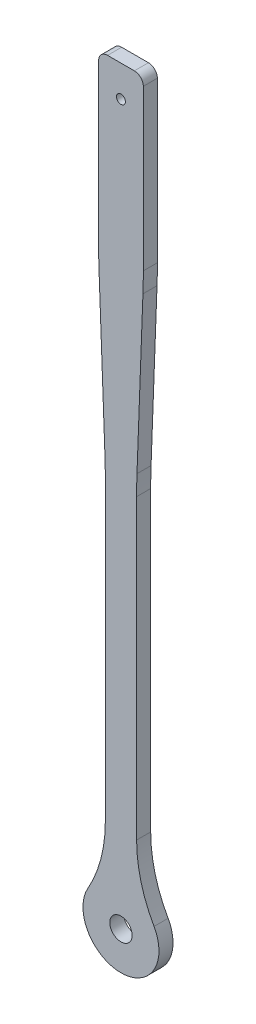
ISO-10303-21;
HEADER;
FILE_DESCRIPTION(('STEP AP214'),'2;1');
FILE_NAME('part.step','',(''),(''),'','','');
FILE_SCHEMA(('AUTOMOTIVE_DESIGN { 1 0 10303 214 1 1 1 1 }'));
ENDSEC;
DATA;
#1=APPLICATION_CONTEXT('core data for automotive mechanical design processes');
#2=APPLICATION_PROTOCOL_DEFINITION('international standard','automotive_design',2000,#1);
#3=PRODUCT_CONTEXT('',#1,'mechanical');
#4=PRODUCT('Part','Part','',(#3));
#5=PRODUCT_RELATED_PRODUCT_CATEGORY('part','',(#4));
#6=PRODUCT_DEFINITION_FORMATION('','',#4);
#7=PRODUCT_DEFINITION_CONTEXT('part definition',#1,'design');
#8=PRODUCT_DEFINITION('design','',#6,#7);
#9=PRODUCT_DEFINITION_SHAPE('','',#8);
#10=(LENGTH_UNIT() NAMED_UNIT(*) SI_UNIT(.MILLI.,.METRE.));
#11=(NAMED_UNIT(*) PLANE_ANGLE_UNIT() SI_UNIT($,.RADIAN.));
#12=(NAMED_UNIT(*) SI_UNIT($,.STERADIAN.) SOLID_ANGLE_UNIT());
#13=UNCERTAINTY_MEASURE_WITH_UNIT(LENGTH_MEASURE(1.E-05),#10,'distance_accuracy_value','');
#14=(GEOMETRIC_REPRESENTATION_CONTEXT(3) GLOBAL_UNCERTAINTY_ASSIGNED_CONTEXT((#13)) GLOBAL_UNIT_ASSIGNED_CONTEXT((#10,
#11,#12)) REPRESENTATION_CONTEXT('',''));
#15=CARTESIAN_POINT('',(0.,0.,0.));
#16=DIRECTION('',(0.,0.,1.));
#17=DIRECTION('',(1.,0.,0.));
#18=AXIS2_PLACEMENT_3D('',#15,#16,#17);
#19=CARTESIAN_POINT('',(42.545,-36.5408219288838,4.));
#20=DIRECTION('',(0.,0.,-1.));
#21=DIRECTION('',(-1.,0.,0.));
#22=AXIS2_PLACEMENT_3D('',#19,#20,#21);
#23=PLANE('',#22);
#24=CARTESIAN_POINT('',(42.545,-36.5408219288838,4.));
#25=DIRECTION('',(0.,0.,-1.));
#26=DIRECTION('',(-1.,0.,0.));
#27=AXIS2_PLACEMENT_3D('',#24,#25,#26);
#28=CIRCLE('',#27,38.1);
#29=CARTESIAN_POINT('',(9.39305194805195,-55.3173588928966,4.));
#30=VERTEX_POINT('',#29);
#31=CARTESIAN_POINT('',(4.445,-36.5408219288838,4.));
#32=VERTEX_POINT('',#31);
#33=EDGE_CURVE('E242',#30,#32,#28,.T.);
#34=ORIENTED_EDGE('',*,*,#33,.T.);
#35=DIRECTION('',(0.,1.,0.));
#36=VECTOR('',#35,1.);
#37=CARTESIAN_POINT('',(4.445,-36.5408219288838,4.));
#38=LINE('',#37,#36);
#39=CARTESIAN_POINT('',(4.44499999999998,47.9435038841113,4.));
#40=VERTEX_POINT('',#39);
#41=EDGE_CURVE('E130',#32,#40,#38,.T.);
#42=ORIENTED_EDGE('',*,*,#41,.T.);
#43=CARTESIAN_POINT('',(156.845,47.9435038841113,4.));
#44=DIRECTION('',(0.,0.,-1.));
#45=DIRECTION('',(1.,0.,0.));
#46=AXIS2_PLACEMENT_3D('',#43,#44,#45);
#47=CIRCLE('',#46,152.4);
#48=CARTESIAN_POINT('',(4.55204336592083,53.6544897578893,4.));
#49=VERTEX_POINT('',#48);
#50=EDGE_CURVE('E295',#40,#49,#47,.T.);
#51=ORIENTED_EDGE('',*,*,#50,.T.);
#52=DIRECTION('',(0.0374736605890955,0.999297615709181,0.));
#53=VECTOR('',#52,1.);
#54=CARTESIAN_POINT('',(4.55204336592083,53.6544897578893,4.));
#55=LINE('',#54,#53);
#56=CARTESIAN_POINT('',(6.24295663407914,98.7455102421103,4.));
#57=VERTEX_POINT('',#56);
#58=EDGE_CURVE('E315',#49,#57,#55,.T.);
#59=ORIENTED_EDGE('',*,*,#58,.T.);
#60=CARTESIAN_POINT('',(-146.05,104.456496115888,4.));
#61=DIRECTION('',(0.,0.,1.));
#62=DIRECTION('',(1.,0.,0.));
#63=AXIS2_PLACEMENT_3D('',#60,#61,#62);
#64=CIRCLE('',#63,152.4);
#65=CARTESIAN_POINT('',(6.34999999999999,104.456496115888,4.));
#66=VERTEX_POINT('',#65);
#67=EDGE_CURVE('E311',#57,#66,#64,.T.);
#68=ORIENTED_EDGE('',*,*,#67,.T.);
#69=DIRECTION('',(0.,1.,0.));
#70=VECTOR('',#69,1.);
#71=CARTESIAN_POINT('',(6.34999999999999,104.456496115888,4.));
#72=LINE('',#71,#70);
#73=CARTESIAN_POINT('',(6.34999999999999,149.86,4.));
#74=VERTEX_POINT('',#73);
#75=EDGE_CURVE('E314',#66,#74,#72,.T.);
#76=ORIENTED_EDGE('',*,*,#75,.T.);
#77=CARTESIAN_POINT('',(3.81,149.86,4.));
#78=DIRECTION('',(0.,0.,1.));
#79=DIRECTION('',(1.,0.,0.));
#80=AXIS2_PLACEMENT_3D('',#77,#78,#79);
#81=CIRCLE('',#80,2.53999999999999);
#82=CARTESIAN_POINT('',(3.81,152.4,4.));
#83=VERTEX_POINT('',#82);
#84=EDGE_CURVE('E319',#74,#83,#81,.T.);
#85=ORIENTED_EDGE('',*,*,#84,.T.);
#86=DIRECTION('',(-1.,0.,0.));
#87=VECTOR('',#86,1.);
#88=CARTESIAN_POINT('',(3.81,152.4,4.));
#89=LINE('',#88,#87);
#90=CARTESIAN_POINT('',(-3.81,152.4,4.));
#91=VERTEX_POINT('',#90);
#92=EDGE_CURVE('E326',#83,#91,#89,.T.);
#93=ORIENTED_EDGE('',*,*,#92,.T.);
#94=CARTESIAN_POINT('',(-3.81,149.86,4.));
#95=DIRECTION('',(0.,0.,1.));
#96=DIRECTION('',(1.,0.,0.));
#97=AXIS2_PLACEMENT_3D('',#94,#95,#96);
#98=CIRCLE('',#97,2.53999999999999);
#99=CARTESIAN_POINT('',(-6.35,149.86,4.));
#100=VERTEX_POINT('',#99);
#101=EDGE_CURVE('E329',#91,#100,#98,.T.);
#102=ORIENTED_EDGE('',*,*,#101,.T.);
#103=DIRECTION('',(0.,-1.,0.));
#104=VECTOR('',#103,1.);
#105=CARTESIAN_POINT('',(-6.35,149.86,4.));
#106=LINE('',#105,#104);
#107=CARTESIAN_POINT('',(-6.35000000000002,104.456496115888,4.));
#108=VERTEX_POINT('',#107);
#109=EDGE_CURVE('E332',#100,#108,#106,.T.);
#110=ORIENTED_EDGE('',*,*,#109,.T.);
#111=CARTESIAN_POINT('',(146.05,104.456496115888,4.));
#112=DIRECTION('',(0.,0.,1.));
#113=DIRECTION('',(1.,0.,0.));
#114=AXIS2_PLACEMENT_3D('',#111,#112,#113);
#115=CIRCLE('',#114,152.4);
#116=CARTESIAN_POINT('',(-6.24295663407917,98.7455102421104,4.));
#117=VERTEX_POINT('',#116);
#118=EDGE_CURVE('E335',#108,#117,#115,.T.);
#119=ORIENTED_EDGE('',*,*,#118,.T.);
#120=DIRECTION('',(0.0374736605890957,-0.999297615709181,0.));
#121=VECTOR('',#120,1.);
#122=CARTESIAN_POINT('',(-6.24295663407917,98.7455102421104,4.));
#123=LINE('',#122,#121);
#124=CARTESIAN_POINT('',(-4.55204336592085,53.6544897578896,4.));
#125=VERTEX_POINT('',#124);
#126=EDGE_CURVE('E338',#117,#125,#123,.T.);
#127=ORIENTED_EDGE('',*,*,#126,.T.);
#128=CARTESIAN_POINT('',(-156.845,47.9435038841116,4.));
#129=DIRECTION('',(0.,0.,-1.));
#130=DIRECTION('',(1.,0.,0.));
#131=AXIS2_PLACEMENT_3D('',#128,#129,#130);
#132=CIRCLE('',#131,152.4);
#133=CARTESIAN_POINT('',(-4.445,47.9435038841116,4.));
#134=VERTEX_POINT('',#133);
#135=EDGE_CURVE('E173',#125,#134,#132,.T.);
#136=ORIENTED_EDGE('',*,*,#135,.T.);
#137=DIRECTION('',(0.,-1.,0.));
#138=VECTOR('',#137,1.);
#139=CARTESIAN_POINT('',(-4.445,-36.5408219288838,4.));
#140=LINE('',#139,#138);
#141=CARTESIAN_POINT('',(-4.445,-36.5408219288838,4.));
#142=VERTEX_POINT('',#141);
#143=EDGE_CURVE('E167',#134,#142,#140,.T.);
#144=ORIENTED_EDGE('',*,*,#143,.T.);
#145=CARTESIAN_POINT('',(-42.545,-36.5408219288838,4.));
#146=DIRECTION('',(0.,0.,-1.));
#147=DIRECTION('',(1.,0.,0.));
#148=AXIS2_PLACEMENT_3D('',#145,#146,#147);
#149=CIRCLE('',#148,38.1);
#150=CARTESIAN_POINT('',(-9.39305194805195,-55.3173588928966,4.));
#151=VERTEX_POINT('',#150);
#152=EDGE_CURVE('E171',#142,#151,#149,.T.);
#153=ORIENTED_EDGE('',*,*,#152,.T.);
#154=CARTESIAN_POINT('',(0.,-60.6373776993668,4.));
#155=DIRECTION('',(0.,0.,1.));
#156=DIRECTION('',(1.,0.,0.));
#157=AXIS2_PLACEMENT_3D('',#154,#155,#156);
#158=CIRCLE('',#157,10.795);
#159=EDGE_CURVE('E63',#151,#30,#158,.T.);
#160=ORIENTED_EDGE('',*,*,#159,.T.);
#161=EDGE_LOOP('',(#34,#42,#51,#59,#68,#76,#85,#93,#102,#110,#119,#127,#136,#144,#153,#160));
#162=FACE_BOUND('',#161,.T.);
#163=CARTESIAN_POINT('',(0.,143.51,4.));
#164=DIRECTION('',(0.,0.,1.));
#165=DIRECTION('',(1.,0.,0.));
#166=AXIS2_PLACEMENT_3D('',#163,#164,#165);
#167=CIRCLE('',#166,1.27000000000001);
#168=CARTESIAN_POINT('',(1.27000000000001,143.51,4.));
#169=VERTEX_POINT('',#168);
#170=EDGE_CURVE('E200',#169,#169,#167,.T.);
#171=ORIENTED_EDGE('',*,*,#170,.F.);
#172=EDGE_LOOP('',(#171));
#173=FACE_BOUND('',#172,.T.);
#174=CARTESIAN_POINT('',(0.,-60.6373776993668,4.));
#175=DIRECTION('',(0.,0.,1.));
#176=DIRECTION('',(1.,0.,0.));
#177=AXIS2_PLACEMENT_3D('',#174,#175,#176);
#178=CIRCLE('',#177,3.175);
#179=CARTESIAN_POINT('',(3.175,-60.6373776993668,4.));
#180=VERTEX_POINT('',#179);
#181=EDGE_CURVE('E381',#180,#180,#178,.T.);
#182=ORIENTED_EDGE('',*,*,#181,.F.);
#183=EDGE_LOOP('',(#182));
#184=FACE_BOUND('',#183,.T.);
#185=ADVANCED_FACE('F45',(#162,#173,#184),#23,.F.);
#186=CARTESIAN_POINT('',(42.545,-36.5408219288838,0.));
#187=DIRECTION('',(0.,0.,-1.));
#188=DIRECTION('',(-1.,0.,0.));
#189=AXIS2_PLACEMENT_3D('',#186,#187,#188);
#190=PLANE('',#189);
#191=CARTESIAN_POINT('',(0.,143.51,0.));
#192=DIRECTION('',(0.,0.,1.));
#193=DIRECTION('',(1.,0.,0.));
#194=AXIS2_PLACEMENT_3D('',#191,#192,#193);
#195=CIRCLE('',#194,1.27000000000001);
#196=CARTESIAN_POINT('',(1.27000000000001,143.51,0.));
#197=VERTEX_POINT('',#196);
#198=EDGE_CURVE('E388',#197,#197,#195,.T.);
#199=ORIENTED_EDGE('',*,*,#198,.T.);
#200=EDGE_LOOP('',(#199));
#201=FACE_BOUND('',#200,.T.);
#202=CARTESIAN_POINT('',(42.545,-36.5408219288838,0.));
#203=DIRECTION('',(0.,0.,-1.));
#204=DIRECTION('',(-1.,0.,0.));
#205=AXIS2_PLACEMENT_3D('',#202,#203,#204);
#206=CIRCLE('',#205,38.1);
#207=CARTESIAN_POINT('',(9.39305194805195,-55.3173588928966,0.));
#208=VERTEX_POINT('',#207);
#209=CARTESIAN_POINT('',(4.445,-36.5408219288838,0.));
#210=VERTEX_POINT('',#209);
#211=EDGE_CURVE('E195',#208,#210,#206,.T.);
#212=ORIENTED_EDGE('',*,*,#211,.F.);
#213=CARTESIAN_POINT('',(0.,-60.6373776993668,0.));
#214=DIRECTION('',(0.,0.,1.));
#215=DIRECTION('',(1.,0.,0.));
#216=AXIS2_PLACEMENT_3D('',#213,#214,#215);
#217=CIRCLE('',#216,10.795);
#218=CARTESIAN_POINT('',(-9.39305194805195,-55.3173588928966,0.));
#219=VERTEX_POINT('',#218);
#220=EDGE_CURVE('E122',#219,#208,#217,.T.);
#221=ORIENTED_EDGE('',*,*,#220,.F.);
#222=CARTESIAN_POINT('',(-42.545,-36.5408219288838,0.));
#223=DIRECTION('',(0.,0.,-1.));
#224=DIRECTION('',(1.,0.,0.));
#225=AXIS2_PLACEMENT_3D('',#222,#223,#224);
#226=CIRCLE('',#225,38.1);
#227=CARTESIAN_POINT('',(-4.445,-36.5408219288838,0.));
#228=VERTEX_POINT('',#227);
#229=EDGE_CURVE('E116',#228,#219,#226,.T.);
#230=ORIENTED_EDGE('',*,*,#229,.F.);
#231=DIRECTION('',(0.,-1.,0.));
#232=VECTOR('',#231,1.);
#233=CARTESIAN_POINT('',(-4.445,-36.5408219288838,0.));
#234=LINE('',#233,#232);
#235=CARTESIAN_POINT('',(-4.445,47.9435038841116,0.));
#236=VERTEX_POINT('',#235);
#237=EDGE_CURVE('E182',#236,#228,#234,.T.);
#238=ORIENTED_EDGE('',*,*,#237,.F.);
#239=CARTESIAN_POINT('',(-156.845,47.9435038841116,0.));
#240=DIRECTION('',(0.,0.,-1.));
#241=DIRECTION('',(1.,0.,0.));
#242=AXIS2_PLACEMENT_3D('',#239,#240,#241);
#243=CIRCLE('',#242,152.4);
#244=CARTESIAN_POINT('',(-4.55204336592085,53.6544897578896,0.));
#245=VERTEX_POINT('',#244);
#246=EDGE_CURVE('E233',#245,#236,#243,.T.);
#247=ORIENTED_EDGE('',*,*,#246,.F.);
#248=DIRECTION('',(0.0374736605890957,-0.999297615709181,0.));
#249=VECTOR('',#248,1.);
#250=CARTESIAN_POINT('',(-6.24295663407917,98.7455102421104,0.));
#251=LINE('',#250,#249);
#252=CARTESIAN_POINT('',(-6.24295663407917,98.7455102421104,0.));
#253=VERTEX_POINT('',#252);
#254=EDGE_CURVE('E230',#253,#245,#251,.T.);
#255=ORIENTED_EDGE('',*,*,#254,.F.);
#256=CARTESIAN_POINT('',(146.05,104.456496115888,0.));
#257=DIRECTION('',(0.,0.,1.));
#258=DIRECTION('',(1.,0.,0.));
#259=AXIS2_PLACEMENT_3D('',#256,#257,#258);
#260=CIRCLE('',#259,152.4);
#261=CARTESIAN_POINT('',(-6.35000000000002,104.456496115888,0.));
#262=VERTEX_POINT('',#261);
#263=EDGE_CURVE('E227',#262,#253,#260,.T.);
#264=ORIENTED_EDGE('',*,*,#263,.F.);
#265=DIRECTION('',(0.,-1.,0.));
#266=VECTOR('',#265,1.);
#267=CARTESIAN_POINT('',(-6.35,149.86,0.));
#268=LINE('',#267,#266);
#269=CARTESIAN_POINT('',(-6.35,149.86,0.));
#270=VERTEX_POINT('',#269);
#271=EDGE_CURVE('E224',#270,#262,#268,.T.);
#272=ORIENTED_EDGE('',*,*,#271,.F.);
#273=CARTESIAN_POINT('',(-3.81,149.86,0.));
#274=DIRECTION('',(0.,0.,1.));
#275=DIRECTION('',(1.,0.,0.));
#276=AXIS2_PLACEMENT_3D('',#273,#274,#275);
#277=CIRCLE('',#276,2.53999999999999);
#278=CARTESIAN_POINT('',(-3.81,152.4,0.));
#279=VERTEX_POINT('',#278);
#280=EDGE_CURVE('E221',#279,#270,#277,.T.);
#281=ORIENTED_EDGE('',*,*,#280,.F.);
#282=DIRECTION('',(-1.,0.,0.));
#283=VECTOR('',#282,1.);
#284=CARTESIAN_POINT('',(3.81,152.4,0.));
#285=LINE('',#284,#283);
#286=CARTESIAN_POINT('',(3.81,152.4,0.));
#287=VERTEX_POINT('',#286);
#288=EDGE_CURVE('E218',#287,#279,#285,.T.);
#289=ORIENTED_EDGE('',*,*,#288,.F.);
#290=CARTESIAN_POINT('',(3.81,149.86,0.));
#291=DIRECTION('',(0.,0.,1.));
#292=DIRECTION('',(1.,0.,0.));
#293=AXIS2_PLACEMENT_3D('',#290,#291,#292);
#294=CIRCLE('',#293,2.53999999999999);
#295=CARTESIAN_POINT('',(6.34999999999999,149.86,0.));
#296=VERTEX_POINT('',#295);
#297=EDGE_CURVE('E215',#296,#287,#294,.T.);
#298=ORIENTED_EDGE('',*,*,#297,.F.);
#299=DIRECTION('',(0.,1.,0.));
#300=VECTOR('',#299,1.);
#301=CARTESIAN_POINT('',(6.34999999999999,104.456496115888,0.));
#302=LINE('',#301,#300);
#303=CARTESIAN_POINT('',(6.34999999999999,104.456496115888,0.));
#304=VERTEX_POINT('',#303);
#305=EDGE_CURVE('E212',#304,#296,#302,.T.);
#306=ORIENTED_EDGE('',*,*,#305,.F.);
#307=CARTESIAN_POINT('',(-146.05,104.456496115888,0.));
#308=DIRECTION('',(0.,0.,1.));
#309=DIRECTION('',(1.,0.,0.));
#310=AXIS2_PLACEMENT_3D('',#307,#308,#309);
#311=CIRCLE('',#310,152.4);
#312=CARTESIAN_POINT('',(6.24295663407914,98.7455102421103,0.));
#313=VERTEX_POINT('',#312);
#314=EDGE_CURVE('E209',#313,#304,#311,.T.);
#315=ORIENTED_EDGE('',*,*,#314,.F.);
#316=DIRECTION('',(0.0374736605890955,0.999297615709181,0.));
#317=VECTOR('',#316,1.);
#318=CARTESIAN_POINT('',(4.55204336592083,53.6544897578893,0.));
#319=LINE('',#318,#317);
#320=CARTESIAN_POINT('',(4.55204336592083,53.6544897578893,0.));
#321=VERTEX_POINT('',#320);
#322=EDGE_CURVE('E206',#321,#313,#319,.T.);
#323=ORIENTED_EDGE('',*,*,#322,.F.);
#324=CARTESIAN_POINT('',(156.845,47.9435038841113,0.));
#325=DIRECTION('',(0.,0.,-1.));
#326=DIRECTION('',(1.,0.,0.));
#327=AXIS2_PLACEMENT_3D('',#324,#325,#326);
#328=CIRCLE('',#327,152.4);
#329=CARTESIAN_POINT('',(4.44499999999998,47.9435038841113,0.));
#330=VERTEX_POINT('',#329);
#331=EDGE_CURVE('E203',#330,#321,#328,.T.);
#332=ORIENTED_EDGE('',*,*,#331,.F.);
#333=DIRECTION('',(0.,1.,0.));
#334=VECTOR('',#333,1.);
#335=CARTESIAN_POINT('',(4.445,-36.5408219288838,0.));
#336=LINE('',#335,#334);
#337=EDGE_CURVE('E199',#210,#330,#336,.T.);
#338=ORIENTED_EDGE('',*,*,#337,.F.);
#339=EDGE_LOOP('',(#212,#221,#230,#238,#247,#255,#264,#272,#281,#289,#298,#306,#315,#323,#332,#338));
#340=FACE_BOUND('',#339,.T.);
#341=CARTESIAN_POINT('',(0.,-60.6373776993668,0.));
#342=DIRECTION('',(0.,0.,1.));
#343=DIRECTION('',(1.,0.,0.));
#344=AXIS2_PLACEMENT_3D('',#341,#342,#343);
#345=CIRCLE('',#344,3.175);
#346=CARTESIAN_POINT('',(3.175,-60.6373776993668,0.));
#347=VERTEX_POINT('',#346);
#348=EDGE_CURVE('E384',#347,#347,#345,.T.);
#349=ORIENTED_EDGE('',*,*,#348,.T.);
#350=EDGE_LOOP('',(#349));
#351=FACE_BOUND('',#350,.T.);
#352=ADVANCED_FACE('F299',(#201,#340,#351),#190,.T.);
#353=CARTESIAN_POINT('',(42.545,-36.5408219288838,4.));
#354=DIRECTION('',(0.,0.,-1.));
#355=DIRECTION('',(-1.,0.,0.));
#356=AXIS2_PLACEMENT_3D('',#353,#354,#355);
#357=CYLINDRICAL_SURFACE('',#356,38.1);
#358=ORIENTED_EDGE('',*,*,#211,.T.);
#359=DIRECTION('',(0.,0.,-1.));
#360=VECTOR('',#359,1.);
#361=CARTESIAN_POINT('',(4.445,-36.5408219288838,4.));
#362=LINE('',#361,#360);
#363=EDGE_CURVE('E11',#32,#210,#362,.T.);
#364=ORIENTED_EDGE('',*,*,#363,.F.);
#365=ORIENTED_EDGE('',*,*,#33,.F.);
#366=DIRECTION('',(0.,0.,-1.));
#367=VECTOR('',#366,1.);
#368=CARTESIAN_POINT('',(9.39305194805195,-55.3173588928966,4.));
#369=LINE('',#368,#367);
#370=EDGE_CURVE('E191',#30,#208,#369,.T.);
#371=ORIENTED_EDGE('',*,*,#370,.T.);
#372=EDGE_LOOP('',(#358,#364,#365,#371));
#373=FACE_BOUND('',#372,.T.);
#374=ADVANCED_FACE('F47',(#373),#357,.F.);
#375=CARTESIAN_POINT('',(4.445,-36.5408219288838,4.));
#376=DIRECTION('',(-1.,0.,0.));
#377=DIRECTION('',(0.,-1.,0.));
#378=AXIS2_PLACEMENT_3D('',#375,#376,#377);
#379=PLANE('',#378);
#380=ORIENTED_EDGE('',*,*,#337,.T.);
#381=DIRECTION('',(0.,0.,-1.));
#382=VECTOR('',#381,1.);
#383=CARTESIAN_POINT('',(4.44499999999998,47.9435038841113,4.));
#384=LINE('',#383,#382);
#385=EDGE_CURVE('E55',#40,#330,#384,.T.);
#386=ORIENTED_EDGE('',*,*,#385,.F.);
#387=ORIENTED_EDGE('',*,*,#41,.F.);
#388=ORIENTED_EDGE('',*,*,#363,.T.);
#389=EDGE_LOOP('',(#380,#386,#387,#388));
#390=FACE_BOUND('',#389,.T.);
#391=ADVANCED_FACE('F530',(#390),#379,.F.);
#392=CARTESIAN_POINT('',(156.845,47.9435038841113,4.));
#393=DIRECTION('',(0.,0.,-1.));
#394=DIRECTION('',(-1.,0.,0.));
#395=AXIS2_PLACEMENT_3D('',#392,#393,#394);
#396=CYLINDRICAL_SURFACE('',#395,152.4);
#397=ORIENTED_EDGE('',*,*,#331,.T.);
#398=DIRECTION('',(0.,0.,-1.));
#399=VECTOR('',#398,1.);
#400=CARTESIAN_POINT('',(4.55204336592083,53.6544897578893,4.));
#401=LINE('',#400,#399);
#402=EDGE_CURVE('E285',#49,#321,#401,.T.);
#403=ORIENTED_EDGE('',*,*,#402,.F.);
#404=ORIENTED_EDGE('',*,*,#50,.F.);
#405=ORIENTED_EDGE('',*,*,#385,.T.);
#406=EDGE_LOOP('',(#397,#403,#404,#405));
#407=FACE_BOUND('',#406,.T.);
#408=ADVANCED_FACE('F293',(#407),#396,.F.);
#409=CARTESIAN_POINT('',(4.55204336592083,53.6544897578893,4.));
#410=DIRECTION('',(-0.999297615709181,0.0374736605890955,0.));
#411=DIRECTION('',(-0.0374736605890955,-0.999297615709181,0.));
#412=AXIS2_PLACEMENT_3D('',#409,#410,#411);
#413=PLANE('',#412);
#414=ORIENTED_EDGE('',*,*,#322,.T.);
#415=DIRECTION('',(0.,0.,-1.));
#416=VECTOR('',#415,1.);
#417=CARTESIAN_POINT('',(6.24295663407914,98.7455102421103,4.));
#418=LINE('',#417,#416);
#419=EDGE_CURVE('E281',#57,#313,#418,.T.);
#420=ORIENTED_EDGE('',*,*,#419,.F.);
#421=ORIENTED_EDGE('',*,*,#58,.F.);
#422=ORIENTED_EDGE('',*,*,#402,.T.);
#423=EDGE_LOOP('',(#414,#420,#421,#422));
#424=FACE_BOUND('',#423,.T.);
#425=ADVANCED_FACE('F305',(#424),#413,.F.);
#426=CARTESIAN_POINT('',(-146.05,104.456496115888,4.));
#427=DIRECTION('',(0.,0.,-1.));
#428=DIRECTION('',(-1.,0.,0.));
#429=AXIS2_PLACEMENT_3D('',#426,#427,#428);
#430=CYLINDRICAL_SURFACE('',#429,152.4);
#431=ORIENTED_EDGE('',*,*,#314,.T.);
#432=DIRECTION('',(0.,0.,-1.));
#433=VECTOR('',#432,1.);
#434=CARTESIAN_POINT('',(6.34999999999999,104.456496115888,4.));
#435=LINE('',#434,#433);
#436=EDGE_CURVE('E277',#66,#304,#435,.T.);
#437=ORIENTED_EDGE('',*,*,#436,.F.);
#438=ORIENTED_EDGE('',*,*,#67,.F.);
#439=ORIENTED_EDGE('',*,*,#419,.T.);
#440=EDGE_LOOP('',(#431,#437,#438,#439));
#441=FACE_BOUND('',#440,.T.);
#442=ADVANCED_FACE('F309',(#441),#430,.T.);
#443=CARTESIAN_POINT('',(6.34999999999999,104.456496115888,4.));
#444=DIRECTION('',(-1.,0.,0.));
#445=DIRECTION('',(0.,-1.,0.));
#446=AXIS2_PLACEMENT_3D('',#443,#444,#445);
#447=PLANE('',#446);
#448=ORIENTED_EDGE('',*,*,#305,.T.);
#449=DIRECTION('',(0.,0.,-1.));
#450=VECTOR('',#449,1.);
#451=CARTESIAN_POINT('',(6.34999999999999,149.86,4.));
#452=LINE('',#451,#450);
#453=EDGE_CURVE('E273',#74,#296,#452,.T.);
#454=ORIENTED_EDGE('',*,*,#453,.F.);
#455=ORIENTED_EDGE('',*,*,#75,.F.);
#456=ORIENTED_EDGE('',*,*,#436,.T.);
#457=EDGE_LOOP('',(#448,#454,#455,#456));
#458=FACE_BOUND('',#457,.T.);
#459=ADVANCED_FACE('F495',(#458),#447,.F.);
#460=CARTESIAN_POINT('',(3.81,149.86,4.));
#461=DIRECTION('',(0.,0.,-1.));
#462=DIRECTION('',(-1.,0.,0.));
#463=AXIS2_PLACEMENT_3D('',#460,#461,#462);
#464=CYLINDRICAL_SURFACE('',#463,2.53999999999999);
#465=ORIENTED_EDGE('',*,*,#297,.T.);
#466=DIRECTION('',(0.,0.,-1.));
#467=VECTOR('',#466,1.);
#468=CARTESIAN_POINT('',(3.81,152.4,4.));
#469=LINE('',#468,#467);
#470=EDGE_CURVE('E269',#83,#287,#469,.T.);
#471=ORIENTED_EDGE('',*,*,#470,.F.);
#472=ORIENTED_EDGE('',*,*,#84,.F.);
#473=ORIENTED_EDGE('',*,*,#453,.T.);
#474=EDGE_LOOP('',(#465,#471,#472,#473));
#475=FACE_BOUND('',#474,.T.);
#476=ADVANCED_FACE('F485',(#475),#464,.T.);
#477=CARTESIAN_POINT('',(3.81,152.4,4.));
#478=DIRECTION('',(0.,-1.,0.));
#479=DIRECTION('',(0.,0.,-1.));
#480=AXIS2_PLACEMENT_3D('',#477,#478,#479);
#481=PLANE('',#480);
#482=ORIENTED_EDGE('',*,*,#288,.T.);
#483=DIRECTION('',(0.,0.,-1.));
#484=VECTOR('',#483,1.);
#485=CARTESIAN_POINT('',(-3.81,152.4,4.));
#486=LINE('',#485,#484);
#487=EDGE_CURVE('E265',#91,#279,#486,.T.);
#488=ORIENTED_EDGE('',*,*,#487,.F.);
#489=ORIENTED_EDGE('',*,*,#92,.F.);
#490=ORIENTED_EDGE('',*,*,#470,.T.);
#491=EDGE_LOOP('',(#482,#488,#489,#490));
#492=FACE_BOUND('',#491,.T.);
#493=ADVANCED_FACE('F475',(#492),#481,.F.);
#494=CARTESIAN_POINT('',(-3.81,149.86,4.));
#495=DIRECTION('',(0.,0.,-1.));
#496=DIRECTION('',(-1.,0.,0.));
#497=AXIS2_PLACEMENT_3D('',#494,#495,#496);
#498=CYLINDRICAL_SURFACE('',#497,2.53999999999999);
#499=ORIENTED_EDGE('',*,*,#280,.T.);
#500=DIRECTION('',(0.,0.,-1.));
#501=VECTOR('',#500,1.);
#502=CARTESIAN_POINT('',(-6.35,149.86,4.));
#503=LINE('',#502,#501);
#504=EDGE_CURVE('E261',#100,#270,#503,.T.);
#505=ORIENTED_EDGE('',*,*,#504,.F.);
#506=ORIENTED_EDGE('',*,*,#101,.F.);
#507=ORIENTED_EDGE('',*,*,#487,.T.);
#508=EDGE_LOOP('',(#499,#505,#506,#507));
#509=FACE_BOUND('',#508,.T.);
#510=ADVANCED_FACE('F465',(#509),#498,.T.);
#511=CARTESIAN_POINT('',(-6.35,149.86,4.));
#512=DIRECTION('',(1.,0.,0.));
#513=DIRECTION('',(0.,1.,0.));
#514=AXIS2_PLACEMENT_3D('',#511,#512,#513);
#515=PLANE('',#514);
#516=ORIENTED_EDGE('',*,*,#271,.T.);
#517=DIRECTION('',(0.,0.,-1.));
#518=VECTOR('',#517,1.);
#519=CARTESIAN_POINT('',(-6.35000000000002,104.456496115888,4.));
#520=LINE('',#519,#518);
#521=EDGE_CURVE('E257',#108,#262,#520,.T.);
#522=ORIENTED_EDGE('',*,*,#521,.F.);
#523=ORIENTED_EDGE('',*,*,#109,.F.);
#524=ORIENTED_EDGE('',*,*,#504,.T.);
#525=EDGE_LOOP('',(#516,#522,#523,#524));
#526=FACE_BOUND('',#525,.T.);
#527=ADVANCED_FACE('F455',(#526),#515,.F.);
#528=CARTESIAN_POINT('',(146.05,104.456496115888,4.));
#529=DIRECTION('',(0.,0.,-1.));
#530=DIRECTION('',(-1.,0.,0.));
#531=AXIS2_PLACEMENT_3D('',#528,#529,#530);
#532=CYLINDRICAL_SURFACE('',#531,152.4);
#533=ORIENTED_EDGE('',*,*,#263,.T.);
#534=DIRECTION('',(0.,0.,-1.));
#535=VECTOR('',#534,1.);
#536=CARTESIAN_POINT('',(-6.24295663407917,98.7455102421104,4.));
#537=LINE('',#536,#535);
#538=EDGE_CURVE('E253',#117,#253,#537,.T.);
#539=ORIENTED_EDGE('',*,*,#538,.F.);
#540=ORIENTED_EDGE('',*,*,#118,.F.);
#541=ORIENTED_EDGE('',*,*,#521,.T.);
#542=EDGE_LOOP('',(#533,#539,#540,#541));
#543=FACE_BOUND('',#542,.T.);
#544=ADVANCED_FACE('F446',(#543),#532,.T.);
#545=CARTESIAN_POINT('',(-6.24295663407917,98.7455102421104,4.));
#546=DIRECTION('',(0.999297615709181,0.0374736605890957,0.));
#547=DIRECTION('',(-0.0374736605890957,0.999297615709181,0.));
#548=AXIS2_PLACEMENT_3D('',#545,#546,#547);
#549=PLANE('',#548);
#550=ORIENTED_EDGE('',*,*,#254,.T.);
#551=DIRECTION('',(0.,0.,-1.));
#552=VECTOR('',#551,1.);
#553=CARTESIAN_POINT('',(-4.55204336592085,53.6544897578896,4.));
#554=LINE('',#553,#552);
#555=EDGE_CURVE('E249',#125,#245,#554,.T.);
#556=ORIENTED_EDGE('',*,*,#555,.F.);
#557=ORIENTED_EDGE('',*,*,#126,.F.);
#558=ORIENTED_EDGE('',*,*,#538,.T.);
#559=EDGE_LOOP('',(#550,#556,#557,#558));
#560=FACE_BOUND('',#559,.T.);
#561=ADVANCED_FACE('F346',(#560),#549,.F.);
#562=CARTESIAN_POINT('',(-156.845,47.9435038841116,4.));
#563=DIRECTION('',(0.,0.,-1.));
#564=DIRECTION('',(-1.,0.,0.));
#565=AXIS2_PLACEMENT_3D('',#562,#563,#564);
#566=CYLINDRICAL_SURFACE('',#565,152.4);
#567=ORIENTED_EDGE('',*,*,#246,.T.);
#568=DIRECTION('',(0.,0.,-1.));
#569=VECTOR('',#568,1.);
#570=CARTESIAN_POINT('',(-4.445,47.9435038841116,4.));
#571=LINE('',#570,#569);
#572=EDGE_CURVE('E184',#134,#236,#571,.T.);
#573=ORIENTED_EDGE('',*,*,#572,.F.);
#574=ORIENTED_EDGE('',*,*,#135,.F.);
#575=ORIENTED_EDGE('',*,*,#555,.T.);
#576=EDGE_LOOP('',(#567,#573,#574,#575));
#577=FACE_BOUND('',#576,.T.);
#578=ADVANCED_FACE('F350',(#577),#566,.F.);
#579=CARTESIAN_POINT('',(-4.445,-36.5408219288838,4.));
#580=DIRECTION('',(1.,0.,0.));
#581=DIRECTION('',(0.,1.,0.));
#582=AXIS2_PLACEMENT_3D('',#579,#580,#581);
#583=PLANE('',#582);
#584=ORIENTED_EDGE('',*,*,#237,.T.);
#585=DIRECTION('',(0.,0.,-1.));
#586=VECTOR('',#585,1.);
#587=CARTESIAN_POINT('',(-4.445,-36.5408219288838,4.));
#588=LINE('',#587,#586);
#589=EDGE_CURVE('E179',#142,#228,#588,.T.);
#590=ORIENTED_EDGE('',*,*,#589,.F.);
#591=ORIENTED_EDGE('',*,*,#143,.F.);
#592=ORIENTED_EDGE('',*,*,#572,.T.);
#593=EDGE_LOOP('',(#584,#590,#591,#592));
#594=FACE_BOUND('',#593,.T.);
#595=ADVANCED_FACE('F180',(#594),#583,.F.);
#596=CARTESIAN_POINT('',(-42.545,-36.5408219288838,4.));
#597=DIRECTION('',(0.,0.,-1.));
#598=DIRECTION('',(-1.,0.,0.));
#599=AXIS2_PLACEMENT_3D('',#596,#597,#598);
#600=CYLINDRICAL_SURFACE('',#599,38.1);
#601=ORIENTED_EDGE('',*,*,#229,.T.);
#602=DIRECTION('',(0.,0.,-1.));
#603=VECTOR('',#602,1.);
#604=CARTESIAN_POINT('',(-9.39305194805195,-55.3173588928966,4.));
#605=LINE('',#604,#603);
#606=EDGE_CURVE('E185',#151,#219,#605,.T.);
#607=ORIENTED_EDGE('',*,*,#606,.F.);
#608=ORIENTED_EDGE('',*,*,#152,.F.);
#609=ORIENTED_EDGE('',*,*,#589,.T.);
#610=EDGE_LOOP('',(#601,#607,#608,#609));
#611=FACE_BOUND('',#610,.T.);
#612=ADVANCED_FACE('F187',(#611),#600,.F.);
#613=CARTESIAN_POINT('',(0.,-60.6373776993668,4.));
#614=DIRECTION('',(0.,0.,-1.));
#615=DIRECTION('',(-1.,0.,0.));
#616=AXIS2_PLACEMENT_3D('',#613,#614,#615);
#617=CYLINDRICAL_SURFACE('',#616,10.795);
#618=ORIENTED_EDGE('',*,*,#220,.T.);
#619=ORIENTED_EDGE('',*,*,#370,.F.);
#620=ORIENTED_EDGE('',*,*,#159,.F.);
#621=ORIENTED_EDGE('',*,*,#606,.T.);
#622=EDGE_LOOP('',(#618,#619,#620,#621));
#623=FACE_BOUND('',#622,.T.);
#624=ADVANCED_FACE('F354',(#623),#617,.T.);
#625=CARTESIAN_POINT('',(0.,143.51,4.));
#626=DIRECTION('',(0.,0.,-1.));
#627=DIRECTION('',(-1.,0.,0.));
#628=AXIS2_PLACEMENT_3D('',#625,#626,#627);
#629=CYLINDRICAL_SURFACE('',#628,1.27000000000001);
#630=ORIENTED_EDGE('',*,*,#170,.T.);
#631=EDGE_LOOP('',(#630));
#632=FACE_BOUND('',#631,.T.);
#633=ORIENTED_EDGE('',*,*,#198,.F.);
#634=EDGE_LOOP('',(#633));
#635=FACE_BOUND('',#634,.T.);
#636=ADVANCED_FACE('F356',(#632,#635),#629,.F.);
#637=CARTESIAN_POINT('',(0.,-60.6373776993668,4.));
#638=DIRECTION('',(0.,0.,-1.));
#639=DIRECTION('',(-1.,0.,0.));
#640=AXIS2_PLACEMENT_3D('',#637,#638,#639);
#641=CYLINDRICAL_SURFACE('',#640,3.175);
#642=ORIENTED_EDGE('',*,*,#181,.T.);
#643=EDGE_LOOP('',(#642));
#644=FACE_BOUND('',#643,.T.);
#645=ORIENTED_EDGE('',*,*,#348,.F.);
#646=EDGE_LOOP('',(#645));
#647=FACE_BOUND('',#646,.T.);
#648=ADVANCED_FACE('F362',(#644,#647),#641,.F.);
#649=CLOSED_SHELL('',(#185,#352,#374,#391,#408,#425,#442,#459,#476,#493,#510,#527,#544,#561,
#578,#595,#612,#624,#636,#648));
#650=MANIFOLD_SOLID_BREP('B2',#649);
#651=ADVANCED_BREP_SHAPE_REPRESENTATION('',(#18,#650),#14);
#652=SHAPE_DEFINITION_REPRESENTATION(#9,#651);
ENDSEC;
END-ISO-10303-21;
